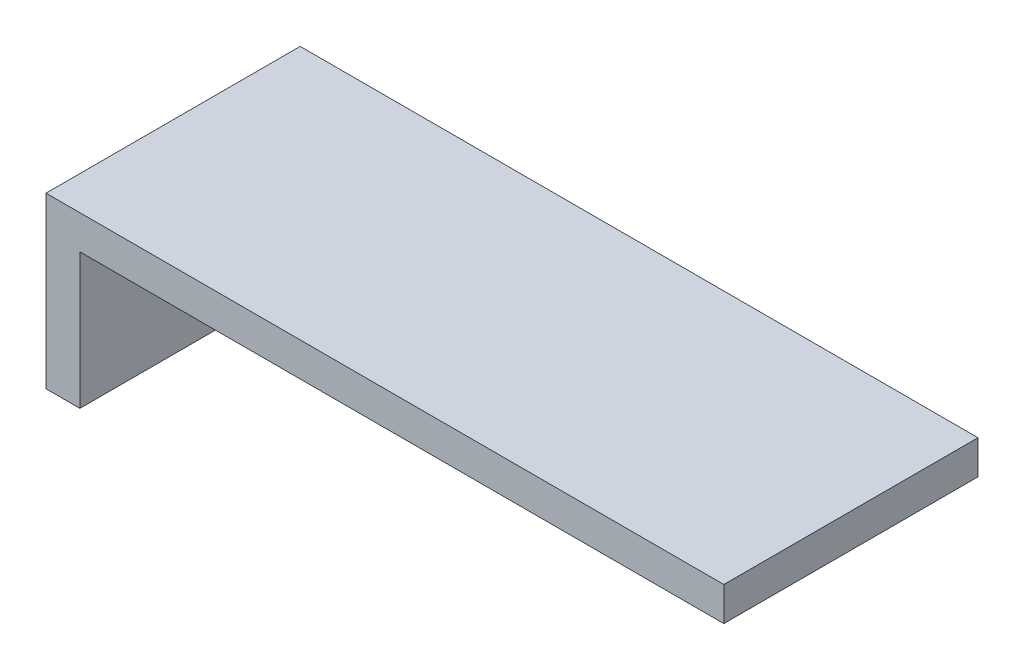
ISO-10303-21;
HEADER;
FILE_DESCRIPTION(('STEP AP214'),'2;1');
FILE_NAME('part.step','',(''),(''),'','','');
FILE_SCHEMA(('AUTOMOTIVE_DESIGN { 1 0 10303 214 1 1 1 1 }'));
ENDSEC;
DATA;
#1=APPLICATION_CONTEXT('core data for automotive mechanical design processes');
#2=APPLICATION_PROTOCOL_DEFINITION('international standard','automotive_design',2000,#1);
#3=PRODUCT_CONTEXT('',#1,'mechanical');
#4=PRODUCT('Part','Part','',(#3));
#5=PRODUCT_RELATED_PRODUCT_CATEGORY('part','',(#4));
#6=PRODUCT_DEFINITION_FORMATION('','',#4);
#7=PRODUCT_DEFINITION_CONTEXT('part definition',#1,'design');
#8=PRODUCT_DEFINITION('design','',#6,#7);
#9=PRODUCT_DEFINITION_SHAPE('','',#8);
#10=(LENGTH_UNIT() NAMED_UNIT(*) SI_UNIT(.MILLI.,.METRE.));
#11=(NAMED_UNIT(*) PLANE_ANGLE_UNIT() SI_UNIT($,.RADIAN.));
#12=(NAMED_UNIT(*) SI_UNIT($,.STERADIAN.) SOLID_ANGLE_UNIT());
#13=UNCERTAINTY_MEASURE_WITH_UNIT(LENGTH_MEASURE(1.E-05),#10,'distance_accuracy_value','');
#14=(GEOMETRIC_REPRESENTATION_CONTEXT(3) GLOBAL_UNCERTAINTY_ASSIGNED_CONTEXT((#13)) GLOBAL_UNIT_ASSIGNED_CONTEXT((#10,
#11,#12)) REPRESENTATION_CONTEXT('',''));
#15=CARTESIAN_POINT('',(0.,0.,0.));
#16=DIRECTION('',(0.,0.,1.));
#17=DIRECTION('',(1.,0.,0.));
#18=AXIS2_PLACEMENT_3D('',#15,#16,#17);
#19=CARTESIAN_POINT('',(0.,2.,0.));
#20=DIRECTION('',(1.,0.,0.));
#21=DIRECTION('',(0.,0.,-1.));
#22=AXIS2_PLACEMENT_3D('',#19,#20,#21);
#23=PLANE('',#22);
#24=DIRECTION('',(0.,-1.,0.));
#25=VECTOR('',#24,1.);
#26=CARTESIAN_POINT('',(0.,2.,-15.));
#27=LINE('',#26,#25);
#28=CARTESIAN_POINT('',(0.,2.,-15.));
#29=VERTEX_POINT('',#28);
#30=CARTESIAN_POINT('',(0.,-8.,-15.));
#31=VERTEX_POINT('',#30);
#32=EDGE_CURVE('E95',#29,#31,#27,.T.);
#33=ORIENTED_EDGE('',*,*,#32,.T.);
#34=DIRECTION('',(0.,0.,-1.));
#35=VECTOR('',#34,1.);
#36=CARTESIAN_POINT('',(0.,-8.,0.));
#37=LINE('',#36,#35);
#38=CARTESIAN_POINT('',(0.,-8.,0.));
#39=VERTEX_POINT('',#38);
#40=EDGE_CURVE('E99',#39,#31,#37,.T.);
#41=ORIENTED_EDGE('',*,*,#40,.F.);
#42=DIRECTION('',(0.,-1.,0.));
#43=VECTOR('',#42,1.);
#44=CARTESIAN_POINT('',(0.,2.,0.));
#45=LINE('',#44,#43);
#46=CARTESIAN_POINT('',(0.,2.,0.));
#47=VERTEX_POINT('',#46);
#48=EDGE_CURVE('E11',#47,#39,#45,.T.);
#49=ORIENTED_EDGE('',*,*,#48,.F.);
#50=DIRECTION('',(0.,0.,1.));
#51=VECTOR('',#50,1.);
#52=CARTESIAN_POINT('',(0.,2.,0.));
#53=LINE('',#52,#51);
#54=EDGE_CURVE('E100',#29,#47,#53,.T.);
#55=ORIENTED_EDGE('',*,*,#54,.F.);
#56=EDGE_LOOP('',(#33,#41,#49,#55));
#57=FACE_BOUND('',#56,.T.);
#58=ADVANCED_FACE('F33',(#57),#23,.F.);
#59=CARTESIAN_POINT('',(0.,2.,0.));
#60=DIRECTION('',(0.,0.,-1.));
#61=DIRECTION('',(-1.,0.,0.));
#62=AXIS2_PLACEMENT_3D('',#59,#60,#61);
#63=PLANE('',#62);
#64=ORIENTED_EDGE('',*,*,#48,.T.);
#65=DIRECTION('',(-1.,0.,0.));
#66=VECTOR('',#65,1.);
#67=CARTESIAN_POINT('',(0.,-8.,0.));
#68=LINE('',#67,#66);
#69=CARTESIAN_POINT('',(2.,-8.,0.));
#70=VERTEX_POINT('',#69);
#71=EDGE_CURVE('E116',#70,#39,#68,.T.);
#72=ORIENTED_EDGE('',*,*,#71,.F.);
#73=DIRECTION('',(0.,1.,0.));
#74=VECTOR('',#73,1.);
#75=CARTESIAN_POINT('',(2.,-8.,0.));
#76=LINE('',#75,#74);
#77=CARTESIAN_POINT('',(2.,0.,0.));
#78=VERTEX_POINT('',#77);
#79=EDGE_CURVE('E121',#70,#78,#76,.T.);
#80=ORIENTED_EDGE('',*,*,#79,.T.);
#81=DIRECTION('',(1.,0.,0.));
#82=VECTOR('',#81,1.);
#83=CARTESIAN_POINT('',(0.,0.,0.));
#84=LINE('',#83,#82);
#85=CARTESIAN_POINT('',(40.,0.,0.));
#86=VERTEX_POINT('',#85);
#87=EDGE_CURVE('E126',#78,#86,#84,.T.);
#88=ORIENTED_EDGE('',*,*,#87,.T.);
#89=DIRECTION('',(0.,-1.,0.));
#90=VECTOR('',#89,1.);
#91=CARTESIAN_POINT('',(40.,2.,0.));
#92=LINE('',#91,#90);
#93=CARTESIAN_POINT('',(40.,2.,0.));
#94=VERTEX_POINT('',#93);
#95=EDGE_CURVE('E40',#94,#86,#92,.T.);
#96=ORIENTED_EDGE('',*,*,#95,.F.);
#97=DIRECTION('',(1.,0.,0.));
#98=VECTOR('',#97,1.);
#99=CARTESIAN_POINT('',(0.,2.,0.));
#100=LINE('',#99,#98);
#101=EDGE_CURVE('E79',#47,#94,#100,.T.);
#102=ORIENTED_EDGE('',*,*,#101,.F.);
#103=EDGE_LOOP('',(#64,#72,#80,#88,#96,#102));
#104=FACE_BOUND('',#103,.T.);
#105=ADVANCED_FACE('F142',(#104),#63,.F.);
#106=CARTESIAN_POINT('',(40.,2.,0.));
#107=DIRECTION('',(-1.,0.,0.));
#108=DIRECTION('',(0.,0.,1.));
#109=AXIS2_PLACEMENT_3D('',#106,#107,#108);
#110=PLANE('',#109);
#111=DIRECTION('',(0.,0.,-1.));
#112=VECTOR('',#111,1.);
#113=CARTESIAN_POINT('',(40.,0.,0.));
#114=LINE('',#113,#112);
#115=CARTESIAN_POINT('',(40.,0.,-15.));
#116=VERTEX_POINT('',#115);
#117=EDGE_CURVE('E72',#86,#116,#114,.T.);
#118=ORIENTED_EDGE('',*,*,#117,.T.);
#119=DIRECTION('',(0.,-1.,0.));
#120=VECTOR('',#119,1.);
#121=CARTESIAN_POINT('',(40.,2.,-15.));
#122=LINE('',#121,#120);
#123=CARTESIAN_POINT('',(40.,2.,-15.));
#124=VERTEX_POINT('',#123);
#125=EDGE_CURVE('E102',#124,#116,#122,.T.);
#126=ORIENTED_EDGE('',*,*,#125,.F.);
#127=DIRECTION('',(0.,0.,-1.));
#128=VECTOR('',#127,1.);
#129=CARTESIAN_POINT('',(40.,2.,0.));
#130=LINE('',#129,#128);
#131=EDGE_CURVE('E130',#94,#124,#130,.T.);
#132=ORIENTED_EDGE('',*,*,#131,.F.);
#133=ORIENTED_EDGE('',*,*,#95,.T.);
#134=EDGE_LOOP('',(#118,#126,#132,#133));
#135=FACE_BOUND('',#134,.T.);
#136=ADVANCED_FACE('F137',(#135),#110,.F.);
#137=CARTESIAN_POINT('',(0.,2.,-15.));
#138=DIRECTION('',(0.,0.,1.));
#139=DIRECTION('',(1.,0.,0.));
#140=AXIS2_PLACEMENT_3D('',#137,#138,#139);
#141=PLANE('',#140);
#142=DIRECTION('',(-1.,0.,0.));
#143=VECTOR('',#142,1.);
#144=CARTESIAN_POINT('',(0.,0.,-15.));
#145=LINE('',#144,#143);
#146=CARTESIAN_POINT('',(2.,0.,-15.));
#147=VERTEX_POINT('',#146);
#148=EDGE_CURVE('E128',#116,#147,#145,.T.);
#149=ORIENTED_EDGE('',*,*,#148,.T.);
#150=DIRECTION('',(0.,1.,0.));
#151=VECTOR('',#150,1.);
#152=CARTESIAN_POINT('',(2.,-8.,-15.));
#153=LINE('',#152,#151);
#154=CARTESIAN_POINT('',(2.,-8.,-15.));
#155=VERTEX_POINT('',#154);
#156=EDGE_CURVE('E108',#155,#147,#153,.T.);
#157=ORIENTED_EDGE('',*,*,#156,.F.);
#158=DIRECTION('',(1.,0.,0.));
#159=VECTOR('',#158,1.);
#160=CARTESIAN_POINT('',(0.,-8.,-15.));
#161=LINE('',#160,#159);
#162=EDGE_CURVE('E105',#31,#155,#161,.T.);
#163=ORIENTED_EDGE('',*,*,#162,.F.);
#164=ORIENTED_EDGE('',*,*,#32,.F.);
#165=DIRECTION('',(-1.,0.,0.));
#166=VECTOR('',#165,1.);
#167=CARTESIAN_POINT('',(0.,2.,-15.));
#168=LINE('',#167,#166);
#169=EDGE_CURVE('E56',#124,#29,#168,.T.);
#170=ORIENTED_EDGE('',*,*,#169,.F.);
#171=ORIENTED_EDGE('',*,*,#125,.T.);
#172=EDGE_LOOP('',(#149,#157,#163,#164,#170,#171));
#173=FACE_BOUND('',#172,.T.);
#174=ADVANCED_FACE('F106',(#173),#141,.F.);
#175=CARTESIAN_POINT('',(0.,2.,0.));
#176=DIRECTION('',(0.,-1.,0.));
#177=DIRECTION('',(0.,0.,-1.));
#178=AXIS2_PLACEMENT_3D('',#175,#176,#177);
#179=PLANE('',#178);
#180=ORIENTED_EDGE('',*,*,#54,.T.);
#181=ORIENTED_EDGE('',*,*,#101,.T.);
#182=ORIENTED_EDGE('',*,*,#131,.T.);
#183=ORIENTED_EDGE('',*,*,#169,.T.);
#184=EDGE_LOOP('',(#180,#181,#182,#183));
#185=FACE_BOUND('',#184,.T.);
#186=ADVANCED_FACE('F152',(#185),#179,.F.);
#187=CARTESIAN_POINT('',(0.,0.,0.));
#188=DIRECTION('',(0.,-1.,0.));
#189=DIRECTION('',(0.,0.,-1.));
#190=AXIS2_PLACEMENT_3D('',#187,#188,#189);
#191=PLANE('',#190);
#192=DIRECTION('',(0.,0.,1.));
#193=VECTOR('',#192,1.);
#194=CARTESIAN_POINT('',(2.,0.,0.));
#195=LINE('',#194,#193);
#196=EDGE_CURVE('E47',#147,#78,#195,.T.);
#197=ORIENTED_EDGE('',*,*,#196,.F.);
#198=ORIENTED_EDGE('',*,*,#148,.F.);
#199=ORIENTED_EDGE('',*,*,#117,.F.);
#200=ORIENTED_EDGE('',*,*,#87,.F.);
#201=EDGE_LOOP('',(#197,#198,#199,#200));
#202=FACE_BOUND('',#201,.T.);
#203=ADVANCED_FACE('F138',(#202),#191,.T.);
#204=CARTESIAN_POINT('',(2.,-8.,0.));
#205=DIRECTION('',(-1.,0.,0.));
#206=DIRECTION('',(0.,0.,1.));
#207=AXIS2_PLACEMENT_3D('',#204,#205,#206);
#208=PLANE('',#207);
#209=ORIENTED_EDGE('',*,*,#196,.T.);
#210=ORIENTED_EDGE('',*,*,#79,.F.);
#211=DIRECTION('',(0.,0.,1.));
#212=VECTOR('',#211,1.);
#213=CARTESIAN_POINT('',(2.,-8.,0.));
#214=LINE('',#213,#212);
#215=EDGE_CURVE('E111',#155,#70,#214,.T.);
#216=ORIENTED_EDGE('',*,*,#215,.F.);
#217=ORIENTED_EDGE('',*,*,#156,.T.);
#218=EDGE_LOOP('',(#209,#210,#216,#217));
#219=FACE_BOUND('',#218,.T.);
#220=ADVANCED_FACE('F140',(#219),#208,.F.);
#221=CARTESIAN_POINT('',(0.,-8.,0.));
#222=DIRECTION('',(0.,-1.,0.));
#223=DIRECTION('',(0.,0.,-1.));
#224=AXIS2_PLACEMENT_3D('',#221,#222,#223);
#225=PLANE('',#224);
#226=ORIENTED_EDGE('',*,*,#40,.T.);
#227=ORIENTED_EDGE('',*,*,#162,.T.);
#228=ORIENTED_EDGE('',*,*,#215,.T.);
#229=ORIENTED_EDGE('',*,*,#71,.T.);
#230=EDGE_LOOP('',(#226,#227,#228,#229));
#231=FACE_BOUND('',#230,.T.);
#232=ADVANCED_FACE('F114',(#231),#225,.T.);
#233=CLOSED_SHELL('',(#58,#105,#136,#174,#186,#203,#220,#232));
#234=MANIFOLD_SOLID_BREP('B2',#233);
#235=ADVANCED_BREP_SHAPE_REPRESENTATION('',(#18,#234),#14);
#236=SHAPE_DEFINITION_REPRESENTATION(#9,#235);
ENDSEC;
END-ISO-10303-21;
